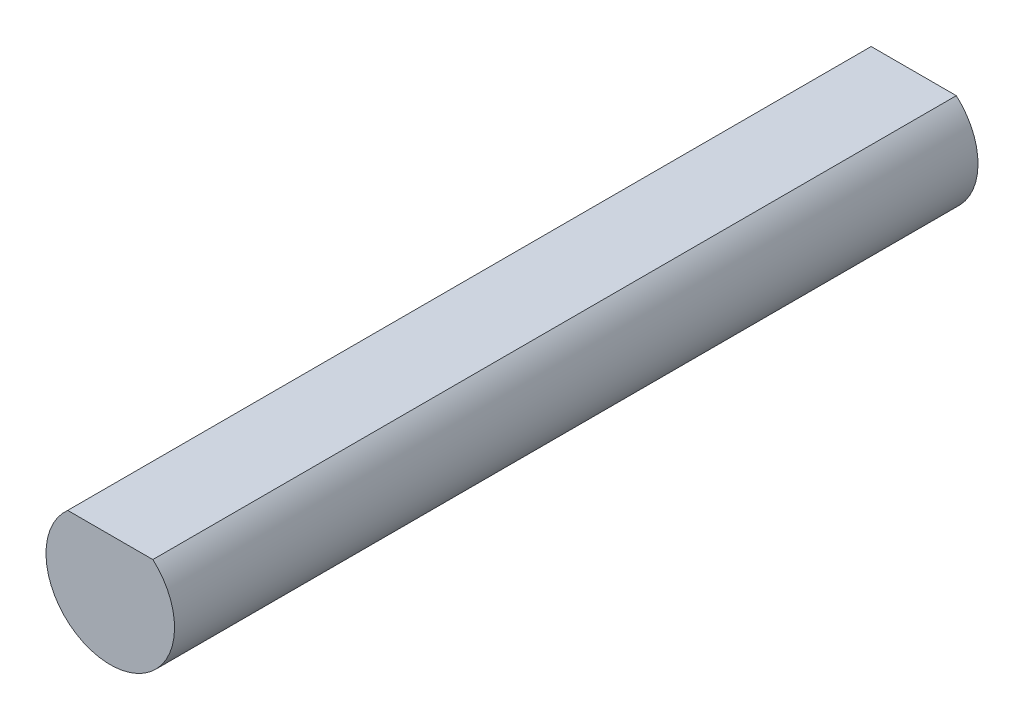
ISO-10303-21;
HEADER;
FILE_DESCRIPTION(('STEP AP214'),'2;1');
FILE_NAME('part.step','',(''),(''),'','','');
FILE_SCHEMA(('AUTOMOTIVE_DESIGN { 1 0 10303 214 1 1 1 1 }'));
ENDSEC;
DATA;
#1=APPLICATION_CONTEXT('core data for automotive mechanical design processes');
#2=APPLICATION_PROTOCOL_DEFINITION('international standard','automotive_design',2000,#1);
#3=PRODUCT_CONTEXT('',#1,'mechanical');
#4=PRODUCT('Part','Part','',(#3));
#5=PRODUCT_RELATED_PRODUCT_CATEGORY('part','',(#4));
#6=PRODUCT_DEFINITION_FORMATION('','',#4);
#7=PRODUCT_DEFINITION_CONTEXT('part definition',#1,'design');
#8=PRODUCT_DEFINITION('design','',#6,#7);
#9=PRODUCT_DEFINITION_SHAPE('','',#8);
#10=(LENGTH_UNIT() NAMED_UNIT(*) SI_UNIT(.MILLI.,.METRE.));
#11=(NAMED_UNIT(*) PLANE_ANGLE_UNIT() SI_UNIT($,.RADIAN.));
#12=(NAMED_UNIT(*) SI_UNIT($,.STERADIAN.) SOLID_ANGLE_UNIT());
#13=UNCERTAINTY_MEASURE_WITH_UNIT(LENGTH_MEASURE(1.E-05),#10,'distance_accuracy_value','');
#14=(GEOMETRIC_REPRESENTATION_CONTEXT(3) GLOBAL_UNCERTAINTY_ASSIGNED_CONTEXT((#13)) GLOBAL_UNIT_ASSIGNED_CONTEXT((#10,
#11,#12)) REPRESENTATION_CONTEXT('',''));
#15=CARTESIAN_POINT('',(0.,0.,0.));
#16=DIRECTION('',(0.,0.,1.));
#17=DIRECTION('',(1.,0.,0.));
#18=AXIS2_PLACEMENT_3D('',#15,#16,#17);
#19=CARTESIAN_POINT('',(0.,0.,25.));
#20=DIRECTION('',(0.,0.,-1.));
#21=DIRECTION('',(-1.,0.,0.));
#22=AXIS2_PLACEMENT_3D('',#19,#20,#21);
#23=CYLINDRICAL_SURFACE('',#22,2.);
#24=CARTESIAN_POINT('',(0.,0.,0.));
#25=DIRECTION('',(0.,0.,1.));
#26=DIRECTION('',(1.,0.,0.));
#27=AXIS2_PLACEMENT_3D('',#24,#25,#26);
#28=CIRCLE('',#27,2.);
#29=CARTESIAN_POINT('',(-1.325,1.49812382665786,0.));
#30=VERTEX_POINT('',#29);
#31=CARTESIAN_POINT('',(1.325,1.49812382665786,0.));
#32=VERTEX_POINT('',#31);
#33=EDGE_CURVE('E67',#30,#32,#28,.T.);
#34=ORIENTED_EDGE('',*,*,#33,.T.);
#35=DIRECTION('',(0.,0.,-1.));
#36=VECTOR('',#35,1.);
#37=CARTESIAN_POINT('',(1.325,1.49812382665786,25.));
#38=LINE('',#37,#36);
#39=CARTESIAN_POINT('',(1.325,1.49812382665786,25.));
#40=VERTEX_POINT('',#39);
#41=EDGE_CURVE('E11',#40,#32,#38,.T.);
#42=ORIENTED_EDGE('',*,*,#41,.F.);
#43=CARTESIAN_POINT('',(0.,0.,25.));
#44=DIRECTION('',(0.,0.,1.));
#45=DIRECTION('',(1.,0.,0.));
#46=AXIS2_PLACEMENT_3D('',#43,#44,#45);
#47=CIRCLE('',#46,2.);
#48=CARTESIAN_POINT('',(-1.325,1.49812382665786,25.));
#49=VERTEX_POINT('',#48);
#50=EDGE_CURVE('E66',#49,#40,#47,.T.);
#51=ORIENTED_EDGE('',*,*,#50,.F.);
#52=DIRECTION('',(0.,0.,-1.));
#53=VECTOR('',#52,1.);
#54=CARTESIAN_POINT('',(-1.325,1.49812382665786,25.));
#55=LINE('',#54,#53);
#56=EDGE_CURVE('E44',#49,#30,#55,.T.);
#57=ORIENTED_EDGE('',*,*,#56,.T.);
#58=EDGE_LOOP('',(#34,#42,#51,#57));
#59=FACE_BOUND('',#58,.T.);
#60=ADVANCED_FACE('F36',(#59),#23,.T.);
#61=CARTESIAN_POINT('',(-1.325,1.49812382665786,25.));
#62=DIRECTION('',(0.,-1.,0.));
#63=DIRECTION('',(0.,0.,-1.));
#64=AXIS2_PLACEMENT_3D('',#61,#62,#63);
#65=PLANE('',#64);
#66=DIRECTION('',(-1.,0.,0.));
#67=VECTOR('',#66,1.);
#68=CARTESIAN_POINT('',(-1.325,1.49812382665786,0.));
#69=LINE('',#68,#67);
#70=EDGE_CURVE('E59',#32,#30,#69,.T.);
#71=ORIENTED_EDGE('',*,*,#70,.T.);
#72=ORIENTED_EDGE('',*,*,#56,.F.);
#73=DIRECTION('',(-1.,0.,0.));
#74=VECTOR('',#73,1.);
#75=CARTESIAN_POINT('',(-1.325,1.49812382665786,25.));
#76=LINE('',#75,#74);
#77=EDGE_CURVE('E51',#40,#49,#76,.T.);
#78=ORIENTED_EDGE('',*,*,#77,.F.);
#79=ORIENTED_EDGE('',*,*,#41,.T.);
#80=EDGE_LOOP('',(#71,#72,#78,#79));
#81=FACE_BOUND('',#80,.T.);
#82=ADVANCED_FACE('F62',(#81),#65,.F.);
#83=CARTESIAN_POINT('',(0.,0.,25.));
#84=DIRECTION('',(0.,0.,1.));
#85=DIRECTION('',(1.,0.,0.));
#86=AXIS2_PLACEMENT_3D('',#83,#84,#85);
#87=PLANE('',#86);
#88=ORIENTED_EDGE('',*,*,#50,.T.);
#89=ORIENTED_EDGE('',*,*,#77,.T.);
#90=EDGE_LOOP('',(#88,#89));
#91=FACE_BOUND('',#90,.T.);
#92=ADVANCED_FACE('F74',(#91),#87,.T.);
#93=CARTESIAN_POINT('',(0.,0.,0.));
#94=DIRECTION('',(0.,0.,1.));
#95=DIRECTION('',(1.,0.,0.));
#96=AXIS2_PLACEMENT_3D('',#93,#94,#95);
#97=PLANE('',#96);
#98=ORIENTED_EDGE('',*,*,#33,.F.);
#99=ORIENTED_EDGE('',*,*,#70,.F.);
#100=EDGE_LOOP('',(#98,#99));
#101=FACE_BOUND('',#100,.T.);
#102=ADVANCED_FACE('F70',(#101),#97,.F.);
#103=CLOSED_SHELL('',(#60,#82,#92,#102));
#104=MANIFOLD_SOLID_BREP('B2',#103);
#105=ADVANCED_BREP_SHAPE_REPRESENTATION('',(#18,#104),#14);
#106=SHAPE_DEFINITION_REPRESENTATION(#9,#105);
ENDSEC;
END-ISO-10303-21;
